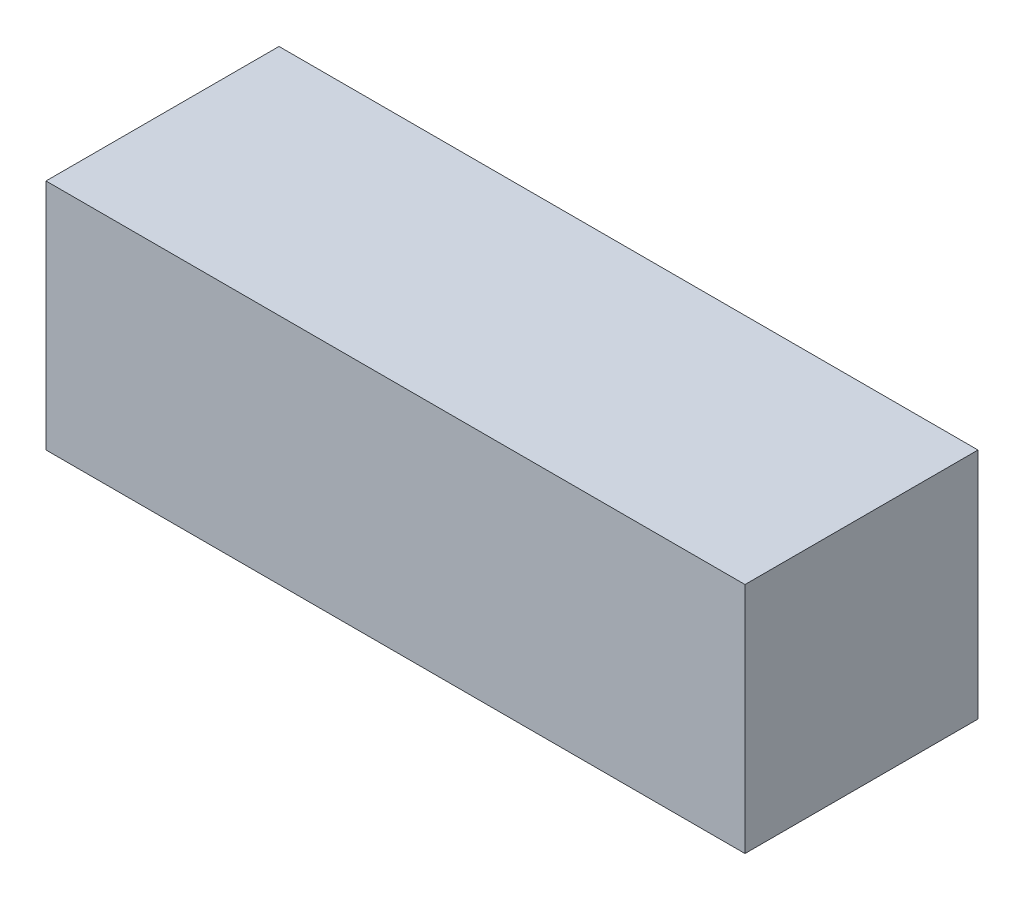
ISO-10303-21;
HEADER;
FILE_DESCRIPTION(('STEP AP214'),'2;1');
FILE_NAME('part.step','',(''),(''),'','','');
FILE_SCHEMA(('AUTOMOTIVE_DESIGN { 1 0 10303 214 1 1 1 1 }'));
ENDSEC;
DATA;
#1=APPLICATION_CONTEXT('core data for automotive mechanical design processes');
#2=APPLICATION_PROTOCOL_DEFINITION('international standard','automotive_design',2000,#1);
#3=PRODUCT_CONTEXT('',#1,'mechanical');
#4=PRODUCT('Part','Part','',(#3));
#5=PRODUCT_RELATED_PRODUCT_CATEGORY('part','',(#4));
#6=PRODUCT_DEFINITION_FORMATION('','',#4);
#7=PRODUCT_DEFINITION_CONTEXT('part definition',#1,'design');
#8=PRODUCT_DEFINITION('design','',#6,#7);
#9=PRODUCT_DEFINITION_SHAPE('','',#8);
#10=(LENGTH_UNIT() NAMED_UNIT(*) SI_UNIT(.MILLI.,.METRE.));
#11=(NAMED_UNIT(*) PLANE_ANGLE_UNIT() SI_UNIT($,.RADIAN.));
#12=(NAMED_UNIT(*) SI_UNIT($,.STERADIAN.) SOLID_ANGLE_UNIT());
#13=UNCERTAINTY_MEASURE_WITH_UNIT(LENGTH_MEASURE(1.E-05),#10,'distance_accuracy_value','');
#14=(GEOMETRIC_REPRESENTATION_CONTEXT(3) GLOBAL_UNCERTAINTY_ASSIGNED_CONTEXT((#13)) GLOBAL_UNIT_ASSIGNED_CONTEXT((#10,
#11,#12)) REPRESENTATION_CONTEXT('',''));
#15=CARTESIAN_POINT('',(0.,0.,0.));
#16=DIRECTION('',(0.,0.,1.));
#17=DIRECTION('',(1.,0.,0.));
#18=AXIS2_PLACEMENT_3D('',#15,#16,#17);
#19=CARTESIAN_POINT('',(0.749999999999999,-0.25,0.5));
#20=DIRECTION('',(-1.,0.,0.));
#21=DIRECTION('',(0.,0.,1.));
#22=AXIS2_PLACEMENT_3D('',#19,#20,#21);
#23=PLANE('',#22);
#24=DIRECTION('',(0.,1.,0.));
#25=VECTOR('',#24,1.);
#26=CARTESIAN_POINT('',(0.749999999999999,-0.25,0.));
#27=LINE('',#26,#25);
#28=CARTESIAN_POINT('',(0.749999999999999,-0.25,0.));
#29=VERTEX_POINT('',#28);
#30=CARTESIAN_POINT('',(0.749999999999999,0.25,0.));
#31=VERTEX_POINT('',#30);
#32=EDGE_CURVE('E97',#29,#31,#27,.T.);
#33=ORIENTED_EDGE('',*,*,#32,.T.);
#34=DIRECTION('',(0.,0.,-1.));
#35=VECTOR('',#34,1.);
#36=CARTESIAN_POINT('',(0.749999999999999,0.25,0.5));
#37=LINE('',#36,#35);
#38=CARTESIAN_POINT('',(0.749999999999999,0.25,0.5));
#39=VERTEX_POINT('',#38);
#40=EDGE_CURVE('E11',#39,#31,#37,.T.);
#41=ORIENTED_EDGE('',*,*,#40,.F.);
#42=DIRECTION('',(0.,1.,0.));
#43=VECTOR('',#42,1.);
#44=CARTESIAN_POINT('',(0.749999999999999,-0.25,0.5));
#45=LINE('',#44,#43);
#46=CARTESIAN_POINT('',(0.749999999999999,-0.25,0.5));
#47=VERTEX_POINT('',#46);
#48=EDGE_CURVE('E85',#47,#39,#45,.T.);
#49=ORIENTED_EDGE('',*,*,#48,.F.);
#50=DIRECTION('',(0.,0.,-1.));
#51=VECTOR('',#50,1.);
#52=CARTESIAN_POINT('',(0.749999999999999,-0.25,0.5));
#53=LINE('',#52,#51);
#54=EDGE_CURVE('E93',#47,#29,#53,.T.);
#55=ORIENTED_EDGE('',*,*,#54,.T.);
#56=EDGE_LOOP('',(#33,#41,#49,#55));
#57=FACE_BOUND('',#56,.T.);
#58=ADVANCED_FACE('F34',(#57),#23,.F.);
#59=CARTESIAN_POINT('',(-0.750000000000001,0.25,0.5));
#60=DIRECTION('',(0.,-1.,0.));
#61=DIRECTION('',(0.,0.,-1.));
#62=AXIS2_PLACEMENT_3D('',#59,#60,#61);
#63=PLANE('',#62);
#64=DIRECTION('',(-1.,0.,0.));
#65=VECTOR('',#64,1.);
#66=CARTESIAN_POINT('',(-0.750000000000001,0.25,0.));
#67=LINE('',#66,#65);
#68=CARTESIAN_POINT('',(-0.750000000000001,0.25,0.));
#69=VERTEX_POINT('',#68);
#70=EDGE_CURVE('E89',#31,#69,#67,.T.);
#71=ORIENTED_EDGE('',*,*,#70,.T.);
#72=DIRECTION('',(0.,0.,-1.));
#73=VECTOR('',#72,1.);
#74=CARTESIAN_POINT('',(-0.750000000000001,0.25,0.5));
#75=LINE('',#74,#73);
#76=CARTESIAN_POINT('',(-0.750000000000001,0.25,0.5));
#77=VERTEX_POINT('',#76);
#78=EDGE_CURVE('E42',#77,#69,#75,.T.);
#79=ORIENTED_EDGE('',*,*,#78,.F.);
#80=DIRECTION('',(-1.,0.,0.));
#81=VECTOR('',#80,1.);
#82=CARTESIAN_POINT('',(-0.750000000000001,0.25,0.5));
#83=LINE('',#82,#81);
#84=EDGE_CURVE('E80',#39,#77,#83,.T.);
#85=ORIENTED_EDGE('',*,*,#84,.F.);
#86=ORIENTED_EDGE('',*,*,#40,.T.);
#87=EDGE_LOOP('',(#71,#79,#85,#86));
#88=FACE_BOUND('',#87,.T.);
#89=ADVANCED_FACE('F88',(#88),#63,.F.);
#90=CARTESIAN_POINT('',(-0.750000000000001,-0.25,0.5));
#91=DIRECTION('',(1.,0.,0.));
#92=DIRECTION('',(0.,0.,-1.));
#93=AXIS2_PLACEMENT_3D('',#90,#91,#92);
#94=PLANE('',#93);
#95=DIRECTION('',(0.,-1.,0.));
#96=VECTOR('',#95,1.);
#97=CARTESIAN_POINT('',(-0.750000000000001,-0.25,0.));
#98=LINE('',#97,#96);
#99=CARTESIAN_POINT('',(-0.750000000000001,-0.25,0.));
#100=VERTEX_POINT('',#99);
#101=EDGE_CURVE('E67',#69,#100,#98,.T.);
#102=ORIENTED_EDGE('',*,*,#101,.T.);
#103=DIRECTION('',(0.,0.,-1.));
#104=VECTOR('',#103,1.);
#105=CARTESIAN_POINT('',(-0.750000000000001,-0.25,0.5));
#106=LINE('',#105,#104);
#107=CARTESIAN_POINT('',(-0.750000000000001,-0.25,0.5));
#108=VERTEX_POINT('',#107);
#109=EDGE_CURVE('E90',#108,#100,#106,.T.);
#110=ORIENTED_EDGE('',*,*,#109,.F.);
#111=DIRECTION('',(0.,-1.,0.));
#112=VECTOR('',#111,1.);
#113=CARTESIAN_POINT('',(-0.750000000000001,-0.25,0.5));
#114=LINE('',#113,#112);
#115=EDGE_CURVE('E83',#77,#108,#114,.T.);
#116=ORIENTED_EDGE('',*,*,#115,.F.);
#117=ORIENTED_EDGE('',*,*,#78,.T.);
#118=EDGE_LOOP('',(#102,#110,#116,#117));
#119=FACE_BOUND('',#118,.T.);
#120=ADVANCED_FACE('F91',(#119),#94,.F.);
#121=CARTESIAN_POINT('',(-0.750000000000001,-0.25,0.5));
#122=DIRECTION('',(0.,1.,0.));
#123=DIRECTION('',(0.,0.,1.));
#124=AXIS2_PLACEMENT_3D('',#121,#122,#123);
#125=PLANE('',#124);
#126=DIRECTION('',(1.,0.,0.));
#127=VECTOR('',#126,1.);
#128=CARTESIAN_POINT('',(-0.750000000000001,-0.25,0.));
#129=LINE('',#128,#127);
#130=EDGE_CURVE('E73',#100,#29,#129,.T.);
#131=ORIENTED_EDGE('',*,*,#130,.T.);
#132=ORIENTED_EDGE('',*,*,#54,.F.);
#133=DIRECTION('',(1.,0.,0.));
#134=VECTOR('',#133,1.);
#135=CARTESIAN_POINT('',(-0.750000000000001,-0.25,0.5));
#136=LINE('',#135,#134);
#137=EDGE_CURVE('E50',#108,#47,#136,.T.);
#138=ORIENTED_EDGE('',*,*,#137,.F.);
#139=ORIENTED_EDGE('',*,*,#109,.T.);
#140=EDGE_LOOP('',(#131,#132,#138,#139));
#141=FACE_BOUND('',#140,.T.);
#142=ADVANCED_FACE('F104',(#141),#125,.F.);
#143=CARTESIAN_POINT('',(0.749999999999999,0.25,0.5));
#144=DIRECTION('',(0.,0.,-1.));
#145=DIRECTION('',(-1.,0.,0.));
#146=AXIS2_PLACEMENT_3D('',#143,#144,#145);
#147=PLANE('',#146);
#148=ORIENTED_EDGE('',*,*,#48,.T.);
#149=ORIENTED_EDGE('',*,*,#84,.T.);
#150=ORIENTED_EDGE('',*,*,#115,.T.);
#151=ORIENTED_EDGE('',*,*,#137,.T.);
#152=EDGE_LOOP('',(#148,#149,#150,#151));
#153=FACE_BOUND('',#152,.T.);
#154=ADVANCED_FACE('F81',(#153),#147,.F.);
#155=CARTESIAN_POINT('',(0.749999999999999,0.25,0.));
#156=DIRECTION('',(0.,0.,-1.));
#157=DIRECTION('',(-1.,0.,0.));
#158=AXIS2_PLACEMENT_3D('',#155,#156,#157);
#159=PLANE('',#158);
#160=ORIENTED_EDGE('',*,*,#32,.F.);
#161=ORIENTED_EDGE('',*,*,#130,.F.);
#162=ORIENTED_EDGE('',*,*,#101,.F.);
#163=ORIENTED_EDGE('',*,*,#70,.F.);
#164=EDGE_LOOP('',(#160,#161,#162,#163));
#165=FACE_BOUND('',#164,.T.);
#166=ADVANCED_FACE('F107',(#165),#159,.T.);
#167=CLOSED_SHELL('',(#58,#89,#120,#142,#154,#166));
#168=MANIFOLD_SOLID_BREP('B2',#167);
#169=ADVANCED_BREP_SHAPE_REPRESENTATION('',(#18,#168),#14);
#170=SHAPE_DEFINITION_REPRESENTATION(#9,#169);
ENDSEC;
END-ISO-10303-21;
